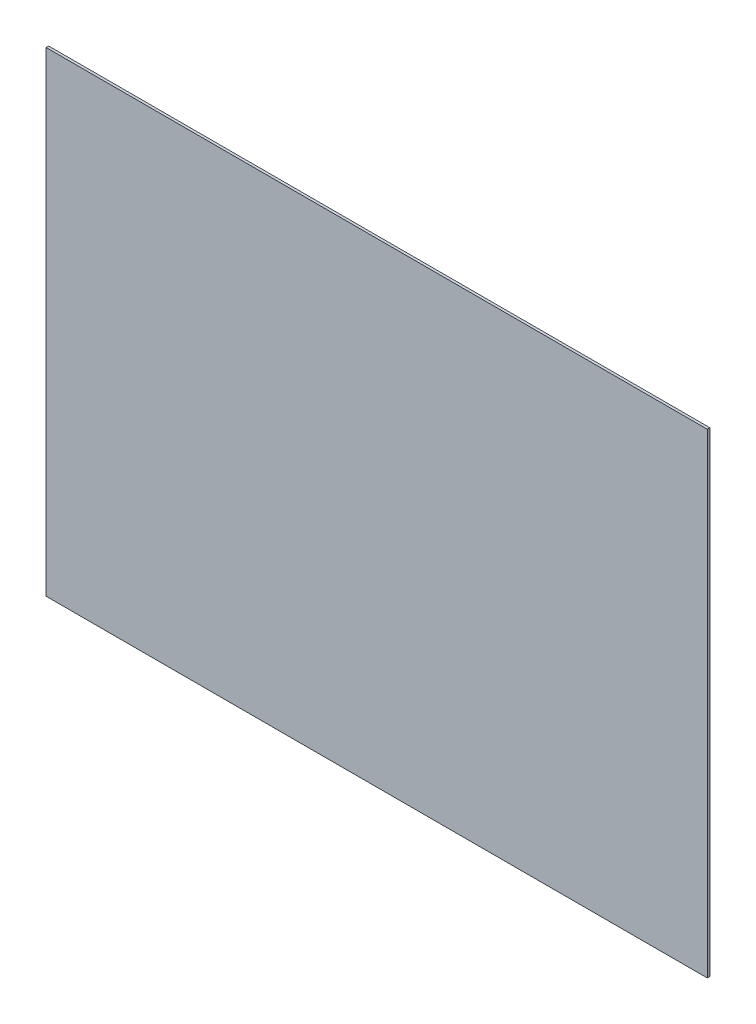
ISO-10303-21;
HEADER;
FILE_DESCRIPTION(('STEP AP214'),'2;1');
FILE_NAME('part.step','',(''),(''),'','','');
FILE_SCHEMA(('AUTOMOTIVE_DESIGN { 1 0 10303 214 1 1 1 1 }'));
ENDSEC;
DATA;
#1=APPLICATION_CONTEXT('core data for automotive mechanical design processes');
#2=APPLICATION_PROTOCOL_DEFINITION('international standard','automotive_design',2000,#1);
#3=PRODUCT_CONTEXT('',#1,'mechanical');
#4=PRODUCT('Part','Part','',(#3));
#5=PRODUCT_RELATED_PRODUCT_CATEGORY('part','',(#4));
#6=PRODUCT_DEFINITION_FORMATION('','',#4);
#7=PRODUCT_DEFINITION_CONTEXT('part definition',#1,'design');
#8=PRODUCT_DEFINITION('design','',#6,#7);
#9=PRODUCT_DEFINITION_SHAPE('','',#8);
#10=(LENGTH_UNIT() NAMED_UNIT(*) SI_UNIT(.MILLI.,.METRE.));
#11=(NAMED_UNIT(*) PLANE_ANGLE_UNIT() SI_UNIT($,.RADIAN.));
#12=(NAMED_UNIT(*) SI_UNIT($,.STERADIAN.) SOLID_ANGLE_UNIT());
#13=UNCERTAINTY_MEASURE_WITH_UNIT(LENGTH_MEASURE(1.E-05),#10,'distance_accuracy_value','');
#14=(GEOMETRIC_REPRESENTATION_CONTEXT(3) GLOBAL_UNCERTAINTY_ASSIGNED_CONTEXT((#13)) GLOBAL_UNIT_ASSIGNED_CONTEXT((#10,
#11,#12)) REPRESENTATION_CONTEXT('',''));
#15=CARTESIAN_POINT('',(0.,0.,0.));
#16=DIRECTION('',(0.,0.,1.));
#17=DIRECTION('',(1.,0.,0.));
#18=AXIS2_PLACEMENT_3D('',#15,#16,#17);
#19=CARTESIAN_POINT('',(0.,0.,3.175));
#20=DIRECTION('',(1.,0.,0.));
#21=DIRECTION('',(0.,0.,-1.));
#22=AXIS2_PLACEMENT_3D('',#19,#20,#21);
#23=PLANE('',#22);
#24=DIRECTION('',(0.,-1.,0.));
#25=VECTOR('',#24,1.);
#26=CARTESIAN_POINT('',(0.,0.,0.));
#27=LINE('',#26,#25);
#28=CARTESIAN_POINT('',(0.,584.2,0.));
#29=VERTEX_POINT('',#28);
#30=CARTESIAN_POINT('',(0.,0.,0.));
#31=VERTEX_POINT('',#30);
#32=EDGE_CURVE('E97',#29,#31,#27,.T.);
#33=ORIENTED_EDGE('',*,*,#32,.T.);
#34=DIRECTION('',(0.,0.,-1.));
#35=VECTOR('',#34,1.);
#36=CARTESIAN_POINT('',(0.,0.,3.175));
#37=LINE('',#36,#35);
#38=CARTESIAN_POINT('',(0.,0.,3.175));
#39=VERTEX_POINT('',#38);
#40=EDGE_CURVE('E11',#39,#31,#37,.T.);
#41=ORIENTED_EDGE('',*,*,#40,.F.);
#42=DIRECTION('',(0.,-1.,0.));
#43=VECTOR('',#42,1.);
#44=CARTESIAN_POINT('',(0.,0.,3.175));
#45=LINE('',#44,#43);
#46=CARTESIAN_POINT('',(0.,584.2,3.175));
#47=VERTEX_POINT('',#46);
#48=EDGE_CURVE('E85',#47,#39,#45,.T.);
#49=ORIENTED_EDGE('',*,*,#48,.F.);
#50=DIRECTION('',(0.,0.,-1.));
#51=VECTOR('',#50,1.);
#52=CARTESIAN_POINT('',(0.,584.2,3.175));
#53=LINE('',#52,#51);
#54=EDGE_CURVE('E93',#47,#29,#53,.T.);
#55=ORIENTED_EDGE('',*,*,#54,.T.);
#56=EDGE_LOOP('',(#33,#41,#49,#55));
#57=FACE_BOUND('',#56,.T.);
#58=ADVANCED_FACE('F34',(#57),#23,.F.);
#59=CARTESIAN_POINT('',(0.,0.,3.175));
#60=DIRECTION('',(0.,1.,0.));
#61=DIRECTION('',(0.,0.,1.));
#62=AXIS2_PLACEMENT_3D('',#59,#60,#61);
#63=PLANE('',#62);
#64=DIRECTION('',(1.,0.,0.));
#65=VECTOR('',#64,1.);
#66=CARTESIAN_POINT('',(0.,0.,0.));
#67=LINE('',#66,#65);
#68=CARTESIAN_POINT('',(812.8,0.,0.));
#69=VERTEX_POINT('',#68);
#70=EDGE_CURVE('E89',#31,#69,#67,.T.);
#71=ORIENTED_EDGE('',*,*,#70,.T.);
#72=DIRECTION('',(0.,0.,-1.));
#73=VECTOR('',#72,1.);
#74=CARTESIAN_POINT('',(812.8,0.,3.175));
#75=LINE('',#74,#73);
#76=CARTESIAN_POINT('',(812.8,0.,3.175));
#77=VERTEX_POINT('',#76);
#78=EDGE_CURVE('E42',#77,#69,#75,.T.);
#79=ORIENTED_EDGE('',*,*,#78,.F.);
#80=DIRECTION('',(1.,0.,0.));
#81=VECTOR('',#80,1.);
#82=CARTESIAN_POINT('',(0.,0.,3.175));
#83=LINE('',#82,#81);
#84=EDGE_CURVE('E80',#39,#77,#83,.T.);
#85=ORIENTED_EDGE('',*,*,#84,.F.);
#86=ORIENTED_EDGE('',*,*,#40,.T.);
#87=EDGE_LOOP('',(#71,#79,#85,#86));
#88=FACE_BOUND('',#87,.T.);
#89=ADVANCED_FACE('F88',(#88),#63,.F.);
#90=CARTESIAN_POINT('',(812.8,0.,3.175));
#91=DIRECTION('',(-1.,0.,0.));
#92=DIRECTION('',(0.,0.,1.));
#93=AXIS2_PLACEMENT_3D('',#90,#91,#92);
#94=PLANE('',#93);
#95=DIRECTION('',(0.,1.,0.));
#96=VECTOR('',#95,1.);
#97=CARTESIAN_POINT('',(812.8,0.,0.));
#98=LINE('',#97,#96);
#99=CARTESIAN_POINT('',(812.8,584.2,0.));
#100=VERTEX_POINT('',#99);
#101=EDGE_CURVE('E67',#69,#100,#98,.T.);
#102=ORIENTED_EDGE('',*,*,#101,.T.);
#103=DIRECTION('',(0.,0.,-1.));
#104=VECTOR('',#103,1.);
#105=CARTESIAN_POINT('',(812.8,584.2,3.175));
#106=LINE('',#105,#104);
#107=CARTESIAN_POINT('',(812.8,584.2,3.175));
#108=VERTEX_POINT('',#107);
#109=EDGE_CURVE('E90',#108,#100,#106,.T.);
#110=ORIENTED_EDGE('',*,*,#109,.F.);
#111=DIRECTION('',(0.,1.,0.));
#112=VECTOR('',#111,1.);
#113=CARTESIAN_POINT('',(812.8,0.,3.175));
#114=LINE('',#113,#112);
#115=EDGE_CURVE('E83',#77,#108,#114,.T.);
#116=ORIENTED_EDGE('',*,*,#115,.F.);
#117=ORIENTED_EDGE('',*,*,#78,.T.);
#118=EDGE_LOOP('',(#102,#110,#116,#117));
#119=FACE_BOUND('',#118,.T.);
#120=ADVANCED_FACE('F91',(#119),#94,.F.);
#121=CARTESIAN_POINT('',(0.,584.2,3.175));
#122=DIRECTION('',(0.,-1.,0.));
#123=DIRECTION('',(0.,0.,-1.));
#124=AXIS2_PLACEMENT_3D('',#121,#122,#123);
#125=PLANE('',#124);
#126=DIRECTION('',(-1.,0.,0.));
#127=VECTOR('',#126,1.);
#128=CARTESIAN_POINT('',(0.,584.2,0.));
#129=LINE('',#128,#127);
#130=EDGE_CURVE('E73',#100,#29,#129,.T.);
#131=ORIENTED_EDGE('',*,*,#130,.T.);
#132=ORIENTED_EDGE('',*,*,#54,.F.);
#133=DIRECTION('',(-1.,0.,0.));
#134=VECTOR('',#133,1.);
#135=CARTESIAN_POINT('',(0.,584.2,3.175));
#136=LINE('',#135,#134);
#137=EDGE_CURVE('E50',#108,#47,#136,.T.);
#138=ORIENTED_EDGE('',*,*,#137,.F.);
#139=ORIENTED_EDGE('',*,*,#109,.T.);
#140=EDGE_LOOP('',(#131,#132,#138,#139));
#141=FACE_BOUND('',#140,.T.);
#142=ADVANCED_FACE('F104',(#141),#125,.F.);
#143=CARTESIAN_POINT('',(0.,0.,3.175));
#144=DIRECTION('',(0.,0.,-1.));
#145=DIRECTION('',(-1.,0.,0.));
#146=AXIS2_PLACEMENT_3D('',#143,#144,#145);
#147=PLANE('',#146);
#148=ORIENTED_EDGE('',*,*,#48,.T.);
#149=ORIENTED_EDGE('',*,*,#84,.T.);
#150=ORIENTED_EDGE('',*,*,#115,.T.);
#151=ORIENTED_EDGE('',*,*,#137,.T.);
#152=EDGE_LOOP('',(#148,#149,#150,#151));
#153=FACE_BOUND('',#152,.T.);
#154=ADVANCED_FACE('F81',(#153),#147,.F.);
#155=CARTESIAN_POINT('',(0.,0.,0.));
#156=DIRECTION('',(0.,0.,-1.));
#157=DIRECTION('',(-1.,0.,0.));
#158=AXIS2_PLACEMENT_3D('',#155,#156,#157);
#159=PLANE('',#158);
#160=ORIENTED_EDGE('',*,*,#32,.F.);
#161=ORIENTED_EDGE('',*,*,#130,.F.);
#162=ORIENTED_EDGE('',*,*,#101,.F.);
#163=ORIENTED_EDGE('',*,*,#70,.F.);
#164=EDGE_LOOP('',(#160,#161,#162,#163));
#165=FACE_BOUND('',#164,.T.);
#166=ADVANCED_FACE('F107',(#165),#159,.T.);
#167=CLOSED_SHELL('',(#58,#89,#120,#142,#154,#166));
#168=MANIFOLD_SOLID_BREP('B2',#167);
#169=ADVANCED_BREP_SHAPE_REPRESENTATION('',(#18,#168),#14);
#170=SHAPE_DEFINITION_REPRESENTATION(#9,#169);
ENDSEC;
END-ISO-10303-21;
